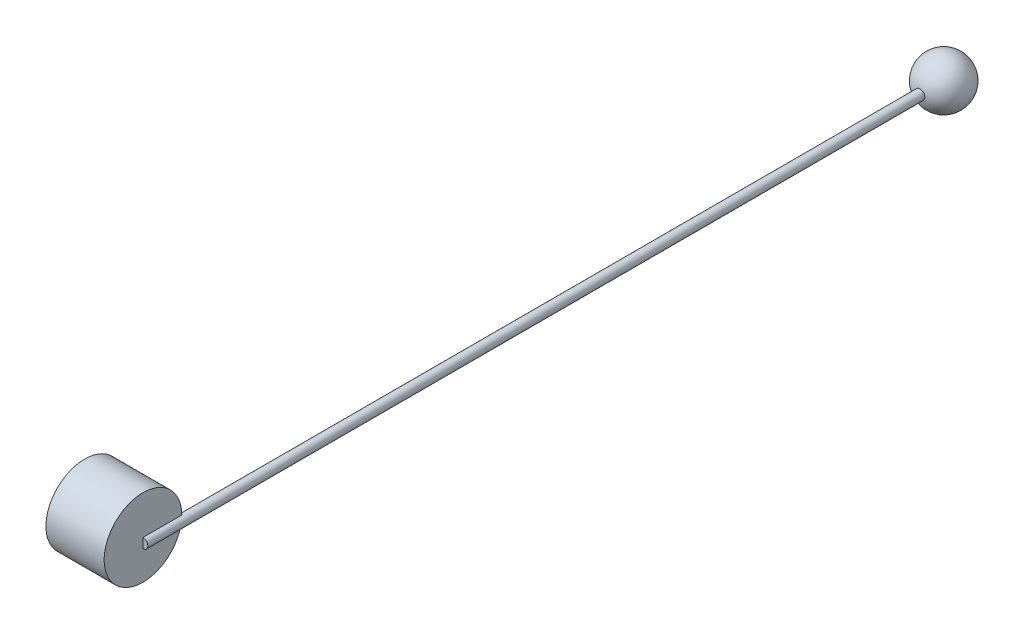
ISO-10303-21;
HEADER;
FILE_DESCRIPTION(('STEP AP214'),'2;1');
FILE_NAME('part.step','',(''),(''),'','','');
FILE_SCHEMA(('AUTOMOTIVE_DESIGN { 1 0 10303 214 1 1 1 1 }'));
ENDSEC;
DATA;
#1=APPLICATION_CONTEXT('core data for automotive mechanical design processes');
#2=APPLICATION_PROTOCOL_DEFINITION('international standard','automotive_design',2000,#1);
#3=PRODUCT_CONTEXT('',#1,'mechanical');
#4=PRODUCT('Part','Part','',(#3));
#5=PRODUCT_RELATED_PRODUCT_CATEGORY('part','',(#4));
#6=PRODUCT_DEFINITION_FORMATION('','',#4);
#7=PRODUCT_DEFINITION_CONTEXT('part definition',#1,'design');
#8=PRODUCT_DEFINITION('design','',#6,#7);
#9=PRODUCT_DEFINITION_SHAPE('','',#8);
#10=(LENGTH_UNIT() NAMED_UNIT(*) SI_UNIT(.MILLI.,.METRE.));
#11=(NAMED_UNIT(*) PLANE_ANGLE_UNIT() SI_UNIT($,.RADIAN.));
#12=(NAMED_UNIT(*) SI_UNIT($,.STERADIAN.) SOLID_ANGLE_UNIT());
#13=UNCERTAINTY_MEASURE_WITH_UNIT(LENGTH_MEASURE(1.E-05),#10,'distance_accuracy_value','');
#14=(GEOMETRIC_REPRESENTATION_CONTEXT(3) GLOBAL_UNCERTAINTY_ASSIGNED_CONTEXT((#13)) GLOBAL_UNIT_ASSIGNED_CONTEXT((#10,
#11,#12)) REPRESENTATION_CONTEXT('',''));
#15=CARTESIAN_POINT('',(0.,0.,0.));
#16=DIRECTION('',(0.,0.,1.));
#17=DIRECTION('',(1.,0.,0.));
#18=AXIS2_PLACEMENT_3D('',#15,#16,#17);
#19=CARTESIAN_POINT('',(-6.,0.5,0.));
#20=DIRECTION('',(1.,0.,0.));
#21=DIRECTION('',(0.,0.,-1.));
#22=AXIS2_PLACEMENT_3D('',#19,#20,#21);
#23=CYLINDRICAL_SURFACE('',#22,4.);
#24=CARTESIAN_POINT('',(-6.,0.5,0.));
#25=DIRECTION('',(1.,0.,0.));
#26=DIRECTION('',(0.,0.,-1.));
#27=AXIS2_PLACEMENT_3D('',#24,#25,#26);
#28=CIRCLE('',#27,4.);
#29=CARTESIAN_POINT('',(-6.,0.5,-4.));
#30=VERTEX_POINT('',#29);
#31=EDGE_CURVE('E11',#30,#30,#28,.T.);
#32=ORIENTED_EDGE('',*,*,#31,.T.);
#33=EDGE_LOOP('',(#32));
#34=FACE_BOUND('',#33,.T.);
#35=CARTESIAN_POINT('',(0.,0.5,0.));
#36=DIRECTION('',(1.,0.,0.));
#37=DIRECTION('',(0.,0.,-1.));
#38=AXIS2_PLACEMENT_3D('',#35,#36,#37);
#39=CIRCLE('',#38,4.);
#40=CARTESIAN_POINT('',(0.,0.5,-4.));
#41=VERTEX_POINT('',#40);
#42=EDGE_CURVE('E54',#41,#41,#39,.T.);
#43=ORIENTED_EDGE('',*,*,#42,.F.);
#44=EDGE_LOOP('',(#43));
#45=FACE_BOUND('',#44,.T.);
#46=ADVANCED_FACE('F51',(#34,#45),#23,.T.);
#47=CARTESIAN_POINT('',(-6.,0.5,0.));
#48=DIRECTION('',(1.,0.,0.));
#49=DIRECTION('',(0.,0.,-1.));
#50=AXIS2_PLACEMENT_3D('',#47,#48,#49);
#51=PLANE('',#50);
#52=ORIENTED_EDGE('',*,*,#31,.F.);
#53=EDGE_LOOP('',(#52));
#54=FACE_BOUND('',#53,.T.);
#55=ADVANCED_FACE('F68',(#54),#51,.F.);
#56=CARTESIAN_POINT('',(0.,0.5,0.));
#57=DIRECTION('',(1.,0.,0.));
#58=DIRECTION('',(0.,0.,-1.));
#59=AXIS2_PLACEMENT_3D('',#56,#57,#58);
#60=PLANE('',#59);
#61=ORIENTED_EDGE('',*,*,#42,.T.);
#62=EDGE_LOOP('',(#61));
#63=FACE_BOUND('',#62,.T.);
#64=ADVANCED_FACE('F65',(#63),#60,.T.);
#65=CLOSED_SHELL('',(#46,#55,#64));
#66=MANIFOLD_SOLID_BREP('B2',#65);
#67=CARTESIAN_POINT('',(0.,0.,-85.002));
#68=DIRECTION('',(0.,0.,1.));
#69=DIRECTION('',(1.,0.,0.));
#70=AXIS2_PLACEMENT_3D('',#67,#68,#69);
#71=CYLINDRICAL_SURFACE('',#70,0.5);
#72=CARTESIAN_POINT('',(0.,0.,0.));
#73=DIRECTION('',(0.,0.,1.));
#74=DIRECTION('',(1.,0.,0.));
#75=AXIS2_PLACEMENT_3D('',#72,#73,#74);
#76=CIRCLE('',#75,0.5);
#77=CARTESIAN_POINT('',(0.5,0.,0.));
#78=VERTEX_POINT('',#77);
#79=EDGE_CURVE('E50',#78,#78,#76,.T.);
#80=ORIENTED_EDGE('',*,*,#79,.F.);
#81=EDGE_LOOP('',(#80));
#82=FACE_BOUND('',#81,.T.);
#83=CARTESIAN_POINT('',(0.,0.,-80.0505102572168));
#84=DIRECTION('',(0.,0.,-1.));
#85=DIRECTION('',(-1.,0.,0.));
#86=AXIS2_PLACEMENT_3D('',#83,#84,#85);
#87=CIRCLE('',#86,0.5);
#88=CARTESIAN_POINT('',(-0.5,0.,-80.0505102572168));
#89=VERTEX_POINT('',#88);
#90=EDGE_CURVE('E100',#89,#89,#87,.F.);
#91=ORIENTED_EDGE('',*,*,#90,.T.);
#92=EDGE_LOOP('',(#91));
#93=FACE_BOUND('',#92,.T.);
#94=ADVANCED_FACE('F93',(#82,#93),#71,.T.);
#95=CARTESIAN_POINT('',(0.,0.,0.));
#96=DIRECTION('',(0.,0.,1.));
#97=DIRECTION('',(1.,0.,0.));
#98=AXIS2_PLACEMENT_3D('',#95,#96,#97);
#99=PLANE('',#98);
#100=ORIENTED_EDGE('',*,*,#79,.T.);
#101=EDGE_LOOP('',(#100));
#102=FACE_BOUND('',#101,.T.);
#103=ADVANCED_FACE('F108',(#102),#99,.T.);
#104=CARTESIAN_POINT('',(0.,0.,-82.5));
#105=DIRECTION('',(0.,0.,1.));
#106=DIRECTION('',(1.,0.,0.));
#107=AXIS2_PLACEMENT_3D('',#104,#105,#106);
#108=SPHERICAL_SURFACE('',#107,2.5);
#109=ORIENTED_EDGE('',*,*,#90,.F.);
#110=EDGE_LOOP('',(#109));
#111=FACE_BOUND('',#110,.T.);
#112=ADVANCED_FACE('F95',(#111),#108,.T.);
#113=CLOSED_SHELL('',(#94,#103,#112));
#114=MANIFOLD_SOLID_BREP('B6',#113);
#115=ADVANCED_BREP_SHAPE_REPRESENTATION('',(#18,#66,#114),#14);
#116=SHAPE_DEFINITION_REPRESENTATION(#9,#115);
ENDSEC;
END-ISO-10303-21;
